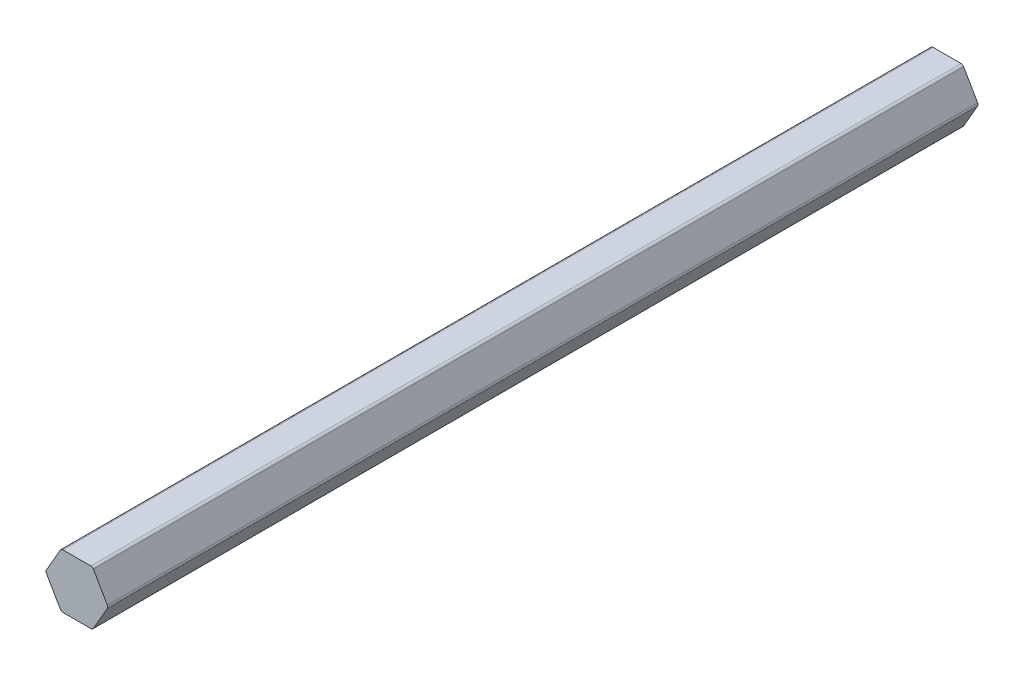
ISO-10303-21;
HEADER;
FILE_DESCRIPTION(('STEP AP214'),'2;1');
FILE_NAME('part.step','',(''),(''),'','','');
FILE_SCHEMA(('AUTOMOTIVE_DESIGN { 1 0 10303 214 1 1 1 1 }'));
ENDSEC;
DATA;
#1=APPLICATION_CONTEXT('core data for automotive mechanical design processes');
#2=APPLICATION_PROTOCOL_DEFINITION('international standard','automotive_design',2000,#1);
#3=PRODUCT_CONTEXT('',#1,'mechanical');
#4=PRODUCT('Part','Part','',(#3));
#5=PRODUCT_RELATED_PRODUCT_CATEGORY('part','',(#4));
#6=PRODUCT_DEFINITION_FORMATION('','',#4);
#7=PRODUCT_DEFINITION_CONTEXT('part definition',#1,'design');
#8=PRODUCT_DEFINITION('design','',#6,#7);
#9=PRODUCT_DEFINITION_SHAPE('','',#8);
#10=(LENGTH_UNIT() NAMED_UNIT(*) SI_UNIT(.MILLI.,.METRE.));
#11=(NAMED_UNIT(*) PLANE_ANGLE_UNIT() SI_UNIT($,.RADIAN.));
#12=(NAMED_UNIT(*) SI_UNIT($,.STERADIAN.) SOLID_ANGLE_UNIT());
#13=UNCERTAINTY_MEASURE_WITH_UNIT(LENGTH_MEASURE(1.E-05),#10,'distance_accuracy_value','');
#14=(GEOMETRIC_REPRESENTATION_CONTEXT(3) GLOBAL_UNCERTAINTY_ASSIGNED_CONTEXT((#13)) GLOBAL_UNIT_ASSIGNED_CONTEXT((#10,
#11,#12)) REPRESENTATION_CONTEXT('',''));
#15=CARTESIAN_POINT('',(0.,0.,0.));
#16=DIRECTION('',(0.,0.,1.));
#17=DIRECTION('',(1.,0.,0.));
#18=AXIS2_PLACEMENT_3D('',#15,#16,#17);
#19=CARTESIAN_POINT('',(2.44900437184856,4.2418,457.2));
#20=DIRECTION('',(0.,0.,-1.));
#21=DIRECTION('',(-1.,0.,0.));
#22=AXIS2_PLACEMENT_3D('',#19,#20,#21);
#23=CYLINDRICAL_SURFACE('',#22,0.508);
#24=CARTESIAN_POINT('',(2.44900437184856,4.2418,304.8));
#25=DIRECTION('',(0.,0.,1.));
#26=DIRECTION('',(1.,0.,0.));
#27=AXIS2_PLACEMENT_3D('',#24,#25,#26);
#28=CIRCLE('',#27,0.508);
#29=CARTESIAN_POINT('',(2.44900437184856,4.7498,304.8));
#30=VERTEX_POINT('',#29);
#31=CARTESIAN_POINT('',(2.88894527697105,4.4958,304.8));
#32=VERTEX_POINT('',#31);
#33=EDGE_CURVE('E252',#30,#32,#28,.F.);
#34=ORIENTED_EDGE('',*,*,#33,.F.);
#35=DIRECTION('',(0.,0.,-1.));
#36=VECTOR('',#35,1.);
#37=CARTESIAN_POINT('',(2.44900437184856,4.7498,457.2));
#38=LINE('',#37,#36);
#39=CARTESIAN_POINT('',(2.44900437184856,4.7498,457.2));
#40=VERTEX_POINT('',#39);
#41=EDGE_CURVE('E177',#40,#30,#38,.T.);
#42=ORIENTED_EDGE('',*,*,#41,.F.);
#43=CARTESIAN_POINT('',(2.44900437184856,4.2418,457.2));
#44=DIRECTION('',(0.,0.,1.));
#45=DIRECTION('',(1.,0.,0.));
#46=AXIS2_PLACEMENT_3D('',#43,#44,#45);
#47=CIRCLE('',#46,0.508);
#48=CARTESIAN_POINT('',(2.88894527697105,4.4958,457.2));
#49=VERTEX_POINT('',#48);
#50=EDGE_CURVE('E172',#49,#40,#47,.T.);
#51=ORIENTED_EDGE('',*,*,#50,.F.);
#52=DIRECTION('',(0.,0.,1.));
#53=VECTOR('',#52,1.);
#54=CARTESIAN_POINT('',(2.88894527697105,4.4958,457.2));
#55=LINE('',#54,#53);
#56=EDGE_CURVE('E166',#32,#49,#55,.T.);
#57=ORIENTED_EDGE('',*,*,#56,.F.);
#58=EDGE_LOOP('',(#34,#42,#51,#57));
#59=FACE_BOUND('',#58,.T.);
#60=ADVANCED_FACE('F47',(#59),#23,.T.);
#61=CARTESIAN_POINT('',(4.89800874369711,0.,457.2));
#62=DIRECTION('',(0.,0.,-1.));
#63=DIRECTION('',(-1.,0.,0.));
#64=AXIS2_PLACEMENT_3D('',#61,#62,#63);
#65=CYLINDRICAL_SURFACE('',#64,0.508);
#66=CARTESIAN_POINT('',(4.89800874369711,0.,304.8));
#67=DIRECTION('',(0.,0.,1.));
#68=DIRECTION('',(1.,0.,0.));
#69=AXIS2_PLACEMENT_3D('',#66,#67,#68);
#70=CIRCLE('',#69,0.508);
#71=CARTESIAN_POINT('',(5.33794964881961,0.254000000000003,304.8));
#72=VERTEX_POINT('',#71);
#73=CARTESIAN_POINT('',(5.3379496488196,-0.254,304.8));
#74=VERTEX_POINT('',#73);
#75=EDGE_CURVE('E258',#72,#74,#70,.F.);
#76=ORIENTED_EDGE('',*,*,#75,.F.);
#77=DIRECTION('',(0.,0.,-1.));
#78=VECTOR('',#77,1.);
#79=CARTESIAN_POINT('',(5.3379496488196,0.254,457.2));
#80=LINE('',#79,#78);
#81=CARTESIAN_POINT('',(5.3379496488196,0.254,457.2));
#82=VERTEX_POINT('',#81);
#83=EDGE_CURVE('E185',#82,#72,#80,.T.);
#84=ORIENTED_EDGE('',*,*,#83,.F.);
#85=CARTESIAN_POINT('',(4.89800874369711,0.,457.2));
#86=DIRECTION('',(0.,0.,1.));
#87=DIRECTION('',(1.,0.,0.));
#88=AXIS2_PLACEMENT_3D('',#85,#86,#87);
#89=CIRCLE('',#88,0.508);
#90=CARTESIAN_POINT('',(5.3379496488196,-0.254,457.2));
#91=VERTEX_POINT('',#90);
#92=EDGE_CURVE('E145',#91,#82,#89,.T.);
#93=ORIENTED_EDGE('',*,*,#92,.F.);
#94=DIRECTION('',(0.,0.,1.));
#95=VECTOR('',#94,1.);
#96=CARTESIAN_POINT('',(5.3379496488196,-0.254,457.2));
#97=LINE('',#96,#95);
#98=EDGE_CURVE('E75',#74,#91,#97,.T.);
#99=ORIENTED_EDGE('',*,*,#98,.F.);
#100=EDGE_LOOP('',(#76,#84,#93,#99));
#101=FACE_BOUND('',#100,.T.);
#102=ADVANCED_FACE('F324',(#101),#65,.T.);
#103=CARTESIAN_POINT('',(2.44900437184856,-4.2418,457.2));
#104=DIRECTION('',(0.,0.,-1.));
#105=DIRECTION('',(-1.,0.,0.));
#106=AXIS2_PLACEMENT_3D('',#103,#104,#105);
#107=CYLINDRICAL_SURFACE('',#106,0.508);
#108=CARTESIAN_POINT('',(2.44900437184856,-4.2418,304.8));
#109=DIRECTION('',(0.,0.,1.));
#110=DIRECTION('',(1.,0.,0.));
#111=AXIS2_PLACEMENT_3D('',#108,#109,#110);
#112=CIRCLE('',#111,0.508);
#113=CARTESIAN_POINT('',(2.88894527697105,-4.4958,304.8));
#114=VERTEX_POINT('',#113);
#115=CARTESIAN_POINT('',(2.44900437184855,-4.7498,304.8));
#116=VERTEX_POINT('',#115);
#117=EDGE_CURVE('E263',#114,#116,#112,.F.);
#118=ORIENTED_EDGE('',*,*,#117,.F.);
#119=DIRECTION('',(0.,0.,-1.));
#120=VECTOR('',#119,1.);
#121=CARTESIAN_POINT('',(2.88894527697105,-4.4958,457.2));
#122=LINE('',#121,#120);
#123=CARTESIAN_POINT('',(2.88894527697105,-4.4958,457.2));
#124=VERTEX_POINT('',#123);
#125=EDGE_CURVE('E199',#124,#114,#122,.T.);
#126=ORIENTED_EDGE('',*,*,#125,.F.);
#127=CARTESIAN_POINT('',(2.44900437184856,-4.2418,457.2));
#128=DIRECTION('',(0.,0.,1.));
#129=DIRECTION('',(1.,0.,0.));
#130=AXIS2_PLACEMENT_3D('',#127,#128,#129);
#131=CIRCLE('',#130,0.508);
#132=CARTESIAN_POINT('',(2.44900437184855,-4.7498,457.2));
#133=VERTEX_POINT('',#132);
#134=EDGE_CURVE('E203',#133,#124,#131,.T.);
#135=ORIENTED_EDGE('',*,*,#134,.F.);
#136=DIRECTION('',(0.,0.,1.));
#137=VECTOR('',#136,1.);
#138=CARTESIAN_POINT('',(2.44900437184856,-4.7498,457.2));
#139=LINE('',#138,#137);
#140=EDGE_CURVE('E189',#116,#133,#139,.T.);
#141=ORIENTED_EDGE('',*,*,#140,.F.);
#142=EDGE_LOOP('',(#118,#126,#135,#141));
#143=FACE_BOUND('',#142,.T.);
#144=ADVANCED_FACE('F310',(#143),#107,.T.);
#145=CARTESIAN_POINT('',(-4.89800874369711,0.,457.2));
#146=DIRECTION('',(0.,0.,-1.));
#147=DIRECTION('',(-1.,0.,0.));
#148=AXIS2_PLACEMENT_3D('',#145,#146,#147);
#149=CYLINDRICAL_SURFACE('',#148,0.508);
#150=CARTESIAN_POINT('',(-4.89800874369711,0.,304.8));
#151=DIRECTION('',(0.,0.,1.));
#152=DIRECTION('',(1.,0.,0.));
#153=AXIS2_PLACEMENT_3D('',#150,#151,#152);
#154=CIRCLE('',#153,0.508);
#155=CARTESIAN_POINT('',(-5.40600874369711,0.,304.8));
#156=VERTEX_POINT('',#155);
#157=CARTESIAN_POINT('',(-5.33794964881959,0.254000000000018,304.8));
#158=VERTEX_POINT('',#157);
#159=EDGE_CURVE('E269',#156,#158,#154,.F.);
#160=ORIENTED_EDGE('',*,*,#159,.F.);
#161=DIRECTION('',(0.,0.,-1.));
#162=VECTOR('',#161,1.);
#163=CARTESIAN_POINT('',(-5.40600874369711,0.,457.2));
#164=LINE('',#163,#162);
#165=CARTESIAN_POINT('',(-5.40600874369711,0.,457.2));
#166=VERTEX_POINT('',#165);
#167=EDGE_CURVE('E210',#166,#156,#164,.T.);
#168=ORIENTED_EDGE('',*,*,#167,.F.);
#169=CARTESIAN_POINT('',(-4.89800874369711,0.,457.2));
#170=DIRECTION('',(0.,0.,1.));
#171=DIRECTION('',(1.,0.,0.));
#172=AXIS2_PLACEMENT_3D('',#169,#170,#171);
#173=CIRCLE('',#172,0.508);
#174=CARTESIAN_POINT('',(-5.3379496488196,0.254,457.2));
#175=VERTEX_POINT('',#174);
#176=EDGE_CURVE('E55',#175,#166,#173,.T.);
#177=ORIENTED_EDGE('',*,*,#176,.F.);
#178=DIRECTION('',(0.,0.,1.));
#179=VECTOR('',#178,1.);
#180=CARTESIAN_POINT('',(-5.3379496488196,0.253999999999997,457.2));
#181=LINE('',#180,#179);
#182=EDGE_CURVE('E96',#158,#175,#181,.T.);
#183=ORIENTED_EDGE('',*,*,#182,.F.);
#184=EDGE_LOOP('',(#160,#168,#177,#183));
#185=FACE_BOUND('',#184,.T.);
#186=ADVANCED_FACE('F287',(#185),#149,.T.);
#187=CARTESIAN_POINT('',(-2.44900437184856,4.2418,457.2));
#188=DIRECTION('',(0.,0.,-1.));
#189=DIRECTION('',(-1.,0.,0.));
#190=AXIS2_PLACEMENT_3D('',#187,#188,#189);
#191=CYLINDRICAL_SURFACE('',#190,0.508);
#192=CARTESIAN_POINT('',(-2.44900437184856,4.2418,304.8));
#193=DIRECTION('',(0.,0.,1.));
#194=DIRECTION('',(1.,0.,0.));
#195=AXIS2_PLACEMENT_3D('',#192,#193,#194);
#196=CIRCLE('',#195,0.508);
#197=CARTESIAN_POINT('',(-2.88894527697104,4.49580000000002,304.8));
#198=VERTEX_POINT('',#197);
#199=CARTESIAN_POINT('',(-2.44900437184856,4.7498,304.8));
#200=VERTEX_POINT('',#199);
#201=EDGE_CURVE('E211',#198,#200,#196,.F.);
#202=ORIENTED_EDGE('',*,*,#201,.F.);
#203=DIRECTION('',(0.,0.,-1.));
#204=VECTOR('',#203,1.);
#205=CARTESIAN_POINT('',(-2.88894527697105,4.4958,457.2));
#206=LINE('',#205,#204);
#207=CARTESIAN_POINT('',(-2.88894527697105,4.4958,457.2));
#208=VERTEX_POINT('',#207);
#209=EDGE_CURVE('E170',#208,#198,#206,.T.);
#210=ORIENTED_EDGE('',*,*,#209,.F.);
#211=CARTESIAN_POINT('',(-2.44900437184856,4.2418,457.2));
#212=DIRECTION('',(0.,0.,1.));
#213=DIRECTION('',(1.,0.,0.));
#214=AXIS2_PLACEMENT_3D('',#211,#212,#213);
#215=CIRCLE('',#214,0.508);
#216=CARTESIAN_POINT('',(-2.44900437184856,4.7498,457.2));
#217=VERTEX_POINT('',#216);
#218=EDGE_CURVE('E113',#217,#208,#215,.T.);
#219=ORIENTED_EDGE('',*,*,#218,.F.);
#220=DIRECTION('',(0.,0.,1.));
#221=VECTOR('',#220,1.);
#222=CARTESIAN_POINT('',(-2.44900437184856,4.7498,457.2));
#223=LINE('',#222,#221);
#224=EDGE_CURVE('E157',#200,#217,#223,.T.);
#225=ORIENTED_EDGE('',*,*,#224,.F.);
#226=EDGE_LOOP('',(#202,#210,#219,#225));
#227=FACE_BOUND('',#226,.T.);
#228=ADVANCED_FACE('F168',(#227),#191,.T.);
#229=CARTESIAN_POINT('',(-2.44900437184855,-4.2418,457.2));
#230=DIRECTION('',(0.,0.,-1.));
#231=DIRECTION('',(-1.,0.,0.));
#232=AXIS2_PLACEMENT_3D('',#229,#230,#231);
#233=CYLINDRICAL_SURFACE('',#232,0.508);
#234=CARTESIAN_POINT('',(-2.44900437184855,-4.2418,304.8));
#235=DIRECTION('',(0.,0.,1.));
#236=DIRECTION('',(1.,0.,0.));
#237=AXIS2_PLACEMENT_3D('',#234,#235,#236);
#238=CIRCLE('',#237,0.508);
#239=CARTESIAN_POINT('',(-2.44900437184855,-4.7498,304.8));
#240=VERTEX_POINT('',#239);
#241=CARTESIAN_POINT('',(-2.88894527697105,-4.4958,304.8));
#242=VERTEX_POINT('',#241);
#243=EDGE_CURVE('E272',#240,#242,#238,.F.);
#244=ORIENTED_EDGE('',*,*,#243,.F.);
#245=DIRECTION('',(0.,0.,-1.));
#246=VECTOR('',#245,1.);
#247=CARTESIAN_POINT('',(-2.44900437184855,-4.7498,457.2));
#248=LINE('',#247,#246);
#249=CARTESIAN_POINT('',(-2.44900437184855,-4.7498,457.2));
#250=VERTEX_POINT('',#249);
#251=EDGE_CURVE('E194',#250,#240,#248,.T.);
#252=ORIENTED_EDGE('',*,*,#251,.F.);
#253=CARTESIAN_POINT('',(-2.44900437184855,-4.2418,457.2));
#254=DIRECTION('',(0.,0.,1.));
#255=DIRECTION('',(1.,0.,0.));
#256=AXIS2_PLACEMENT_3D('',#253,#254,#255);
#257=CIRCLE('',#256,0.508);
#258=CARTESIAN_POINT('',(-2.88894527697104,-4.4958,457.2));
#259=VERTEX_POINT('',#258);
#260=EDGE_CURVE('E206',#259,#250,#257,.T.);
#261=ORIENTED_EDGE('',*,*,#260,.F.);
#262=DIRECTION('',(0.,0.,1.));
#263=VECTOR('',#262,1.);
#264=CARTESIAN_POINT('',(-2.88894527697104,-4.4958,457.2));
#265=LINE('',#264,#263);
#266=EDGE_CURVE('E219',#242,#259,#265,.T.);
#267=ORIENTED_EDGE('',*,*,#266,.F.);
#268=EDGE_LOOP('',(#244,#252,#261,#267));
#269=FACE_BOUND('',#268,.T.);
#270=ADVANCED_FACE('F298',(#269),#233,.T.);
#271=CARTESIAN_POINT('',(2.74229830859688,4.7498,457.2));
#272=DIRECTION('',(0.,0.,1.));
#273=DIRECTION('',(1.,0.,0.));
#274=AXIS2_PLACEMENT_3D('',#271,#272,#273);
#275=PLANE('',#274);
#276=DIRECTION('',(0.5,-0.866025403784439,0.));
#277=VECTOR('',#276,1.);
#278=CARTESIAN_POINT('',(-5.48459661719377,0.,457.2));
#279=LINE('',#278,#277);
#280=CARTESIAN_POINT('',(-5.3379496488196,-0.254,457.2));
#281=VERTEX_POINT('',#280);
#282=EDGE_CURVE('E134',#281,#259,#279,.T.);
#283=ORIENTED_EDGE('',*,*,#282,.T.);
#284=ORIENTED_EDGE('',*,*,#260,.T.);
#285=DIRECTION('',(1.,0.,0.));
#286=VECTOR('',#285,1.);
#287=CARTESIAN_POINT('',(-2.74229830859688,-4.7498,457.2));
#288=LINE('',#287,#286);
#289=EDGE_CURVE('E198',#250,#133,#288,.T.);
#290=ORIENTED_EDGE('',*,*,#289,.T.);
#291=ORIENTED_EDGE('',*,*,#134,.T.);
#292=DIRECTION('',(0.5,0.866025403784439,0.));
#293=VECTOR('',#292,1.);
#294=CARTESIAN_POINT('',(2.74229830859688,-4.7498,457.2));
#295=LINE('',#294,#293);
#296=EDGE_CURVE('E193',#124,#91,#295,.T.);
#297=ORIENTED_EDGE('',*,*,#296,.T.);
#298=ORIENTED_EDGE('',*,*,#92,.T.);
#299=DIRECTION('',(-0.5,0.866025403784439,0.));
#300=VECTOR('',#299,1.);
#301=CARTESIAN_POINT('',(5.48459661719377,0.,457.2));
#302=LINE('',#301,#300);
#303=EDGE_CURVE('E188',#82,#49,#302,.T.);
#304=ORIENTED_EDGE('',*,*,#303,.T.);
#305=ORIENTED_EDGE('',*,*,#50,.T.);
#306=DIRECTION('',(-1.,0.,0.));
#307=VECTOR('',#306,1.);
#308=CARTESIAN_POINT('',(2.74229830859688,4.7498,457.2));
#309=LINE('',#308,#307);
#310=EDGE_CURVE('E160',#40,#217,#309,.T.);
#311=ORIENTED_EDGE('',*,*,#310,.T.);
#312=ORIENTED_EDGE('',*,*,#218,.T.);
#313=DIRECTION('',(-0.5,-0.866025403784439,0.));
#314=VECTOR('',#313,1.);
#315=CARTESIAN_POINT('',(-2.74229830859688,4.7498,457.2));
#316=LINE('',#315,#314);
#317=EDGE_CURVE('E182',#208,#175,#316,.T.);
#318=ORIENTED_EDGE('',*,*,#317,.T.);
#319=ORIENTED_EDGE('',*,*,#176,.T.);
#320=CARTESIAN_POINT('',(-4.89800874369711,0.,457.2));
#321=DIRECTION('',(0.,0.,1.));
#322=DIRECTION('',(1.,0.,0.));
#323=AXIS2_PLACEMENT_3D('',#320,#321,#322);
#324=CIRCLE('',#323,0.508);
#325=EDGE_CURVE('E207',#166,#281,#324,.T.);
#326=ORIENTED_EDGE('',*,*,#325,.T.);
#327=EDGE_LOOP('',(#283,#284,#290,#291,#297,#298,#304,#305,#311,#312,#318,#319,#326));
#328=FACE_BOUND('',#327,.T.);
#329=ADVANCED_FACE('F49',(#328),#275,.T.);
#330=CARTESIAN_POINT('',(2.74229830859688,-4.7498,457.2));
#331=DIRECTION('',(-0.866025403784439,0.5,0.));
#332=DIRECTION('',(0.,0.,1.));
#333=AXIS2_PLACEMENT_3D('',#330,#331,#332);
#334=PLANE('',#333);
#335=ORIENTED_EDGE('',*,*,#125,.T.);
#336=DIRECTION('',(0.5,0.866025403784439,0.));
#337=VECTOR('',#336,1.);
#338=CARTESIAN_POINT('',(2.74229830859688,-4.7498,304.8));
#339=LINE('',#338,#337);
#340=EDGE_CURVE('E261',#114,#74,#339,.T.);
#341=ORIENTED_EDGE('',*,*,#340,.T.);
#342=ORIENTED_EDGE('',*,*,#98,.T.);
#343=ORIENTED_EDGE('',*,*,#296,.F.);
#344=EDGE_LOOP('',(#335,#341,#342,#343));
#345=FACE_BOUND('',#344,.T.);
#346=ADVANCED_FACE('F312',(#345),#334,.F.);
#347=CARTESIAN_POINT('',(-2.74229830859688,-4.7498,457.2));
#348=DIRECTION('',(0.,1.,0.));
#349=DIRECTION('',(1.,0.,0.));
#350=AXIS2_PLACEMENT_3D('',#347,#348,#349);
#351=PLANE('',#350);
#352=ORIENTED_EDGE('',*,*,#251,.T.);
#353=DIRECTION('',(1.,0.,0.));
#354=VECTOR('',#353,1.);
#355=CARTESIAN_POINT('',(-2.74229830859688,-4.7498,304.8));
#356=LINE('',#355,#354);
#357=EDGE_CURVE('E266',#240,#116,#356,.T.);
#358=ORIENTED_EDGE('',*,*,#357,.T.);
#359=ORIENTED_EDGE('',*,*,#140,.T.);
#360=ORIENTED_EDGE('',*,*,#289,.F.);
#361=EDGE_LOOP('',(#352,#358,#359,#360));
#362=FACE_BOUND('',#361,.T.);
#363=ADVANCED_FACE('F304',(#362),#351,.F.);
#364=CARTESIAN_POINT('',(-5.48459661719377,0.,457.2));
#365=DIRECTION('',(0.866025403784438,0.5,0.));
#366=DIRECTION('',(0.,0.,-1.));
#367=AXIS2_PLACEMENT_3D('',#364,#365,#366);
#368=PLANE('',#367);
#369=DIRECTION('',(0.,0.,-1.));
#370=VECTOR('',#369,1.);
#371=CARTESIAN_POINT('',(-5.3379496488196,-0.254,457.2));
#372=LINE('',#371,#370);
#373=CARTESIAN_POINT('',(-5.3379496488196,-0.254,304.8));
#374=VERTEX_POINT('',#373);
#375=EDGE_CURVE('E234',#281,#374,#372,.T.);
#376=ORIENTED_EDGE('',*,*,#375,.T.);
#377=DIRECTION('',(0.5,-0.866025403784438,0.));
#378=VECTOR('',#377,1.);
#379=CARTESIAN_POINT('',(-5.48459661719377,0.,304.8));
#380=LINE('',#379,#378);
#381=EDGE_CURVE('E61',#374,#242,#380,.T.);
#382=ORIENTED_EDGE('',*,*,#381,.T.);
#383=ORIENTED_EDGE('',*,*,#266,.T.);
#384=ORIENTED_EDGE('',*,*,#282,.F.);
#385=EDGE_LOOP('',(#376,#382,#383,#384));
#386=FACE_BOUND('',#385,.T.);
#387=ADVANCED_FACE('F290',(#386),#368,.F.);
#388=CARTESIAN_POINT('',(-2.74229830859688,4.7498,457.2));
#389=DIRECTION('',(0.866025403784439,-0.5,0.));
#390=DIRECTION('',(0.,0.,-1.));
#391=AXIS2_PLACEMENT_3D('',#388,#389,#390);
#392=PLANE('',#391);
#393=ORIENTED_EDGE('',*,*,#209,.T.);
#394=DIRECTION('',(0.5,0.866025403784439,0.));
#395=VECTOR('',#394,1.);
#396=CARTESIAN_POINT('',(26.1418734504317,54.7786530211837,304.8));
#397=LINE('',#396,#395);
#398=EDGE_CURVE('E275',#158,#198,#397,.T.);
#399=ORIENTED_EDGE('',*,*,#398,.F.);
#400=ORIENTED_EDGE('',*,*,#182,.T.);
#401=ORIENTED_EDGE('',*,*,#317,.F.);
#402=EDGE_LOOP('',(#393,#399,#400,#401));
#403=FACE_BOUND('',#402,.T.);
#404=ADVANCED_FACE('F283',(#403),#392,.F.);
#405=CARTESIAN_POINT('',(2.74229830859688,4.7498,457.2));
#406=DIRECTION('',(0.,-1.,0.));
#407=DIRECTION('',(0.,0.,-1.));
#408=AXIS2_PLACEMENT_3D('',#405,#406,#407);
#409=PLANE('',#408);
#410=ORIENTED_EDGE('',*,*,#41,.T.);
#411=DIRECTION('',(-1.,0.,0.));
#412=VECTOR('',#411,1.);
#413=CARTESIAN_POINT('',(2.74229830859688,4.7498,304.8));
#414=LINE('',#413,#412);
#415=EDGE_CURVE('E162',#30,#200,#414,.T.);
#416=ORIENTED_EDGE('',*,*,#415,.T.);
#417=ORIENTED_EDGE('',*,*,#224,.T.);
#418=ORIENTED_EDGE('',*,*,#310,.F.);
#419=EDGE_LOOP('',(#410,#416,#417,#418));
#420=FACE_BOUND('',#419,.T.);
#421=ADVANCED_FACE('F159',(#420),#409,.F.);
#422=CARTESIAN_POINT('',(5.48459661719377,0.,457.2));
#423=DIRECTION('',(-0.866025403784439,-0.5,0.));
#424=DIRECTION('',(-0.5,0.866025403784439,0.));
#425=AXIS2_PLACEMENT_3D('',#422,#423,#424);
#426=PLANE('',#425);
#427=ORIENTED_EDGE('',*,*,#83,.T.);
#428=DIRECTION('',(-0.5,0.866025403784439,0.));
#429=VECTOR('',#428,1.);
#430=CARTESIAN_POINT('',(5.48459661719377,0.,304.8));
#431=LINE('',#430,#429);
#432=EDGE_CURVE('E255',#72,#32,#431,.T.);
#433=ORIENTED_EDGE('',*,*,#432,.T.);
#434=ORIENTED_EDGE('',*,*,#56,.T.);
#435=ORIENTED_EDGE('',*,*,#303,.F.);
#436=EDGE_LOOP('',(#427,#433,#434,#435));
#437=FACE_BOUND('',#436,.T.);
#438=ADVANCED_FACE('F343',(#437),#426,.F.);
#439=CARTESIAN_POINT('',(-4.89800874369711,0.,457.2));
#440=DIRECTION('',(0.,0.,-1.));
#441=DIRECTION('',(-1.,0.,0.));
#442=AXIS2_PLACEMENT_3D('',#439,#440,#441);
#443=CYLINDRICAL_SURFACE('',#442,0.508);
#444=CARTESIAN_POINT('',(-4.89800874369711,0.,304.8));
#445=DIRECTION('',(0.,0.,1.));
#446=DIRECTION('',(1.,0.,0.));
#447=AXIS2_PLACEMENT_3D('',#444,#445,#446);
#448=CIRCLE('',#447,0.508);
#449=EDGE_CURVE('E11',#374,#156,#448,.F.);
#450=ORIENTED_EDGE('',*,*,#449,.F.);
#451=ORIENTED_EDGE('',*,*,#375,.F.);
#452=ORIENTED_EDGE('',*,*,#325,.F.);
#453=ORIENTED_EDGE('',*,*,#167,.T.);
#454=EDGE_LOOP('',(#450,#451,#452,#453));
#455=FACE_BOUND('',#454,.T.);
#456=ADVANCED_FACE('F289',(#455),#443,.T.);
#457=CARTESIAN_POINT('',(36.3665512025475,48.8754325686224,304.8));
#458=DIRECTION('',(0.,0.,1.));
#459=DIRECTION('',(1.,0.,0.));
#460=AXIS2_PLACEMENT_3D('',#457,#458,#459);
#461=PLANE('',#460);
#462=ORIENTED_EDGE('',*,*,#201,.T.);
#463=ORIENTED_EDGE('',*,*,#415,.F.);
#464=ORIENTED_EDGE('',*,*,#33,.T.);
#465=ORIENTED_EDGE('',*,*,#432,.F.);
#466=ORIENTED_EDGE('',*,*,#75,.T.);
#467=ORIENTED_EDGE('',*,*,#340,.F.);
#468=ORIENTED_EDGE('',*,*,#117,.T.);
#469=ORIENTED_EDGE('',*,*,#357,.F.);
#470=ORIENTED_EDGE('',*,*,#243,.T.);
#471=ORIENTED_EDGE('',*,*,#381,.F.);
#472=ORIENTED_EDGE('',*,*,#449,.T.);
#473=ORIENTED_EDGE('',*,*,#159,.T.);
#474=ORIENTED_EDGE('',*,*,#398,.T.);
#475=EDGE_LOOP('',(#462,#463,#464,#465,#466,#467,#468,#469,#470,#471,#472,#473,#474));
#476=FACE_BOUND('',#475,.T.);
#477=ADVANCED_FACE('F278',(#476),#461,.F.);
#478=CLOSED_SHELL('',(#60,#102,#144,#186,#228,#270,#329,#346,#363,#387,#404,#421,#438,#456,#477));
#479=MANIFOLD_SOLID_BREP('B2',#478);
#480=ADVANCED_BREP_SHAPE_REPRESENTATION('',(#18,#479),#14);
#481=SHAPE_DEFINITION_REPRESENTATION(#9,#480);
ENDSEC;
END-ISO-10303-21;
